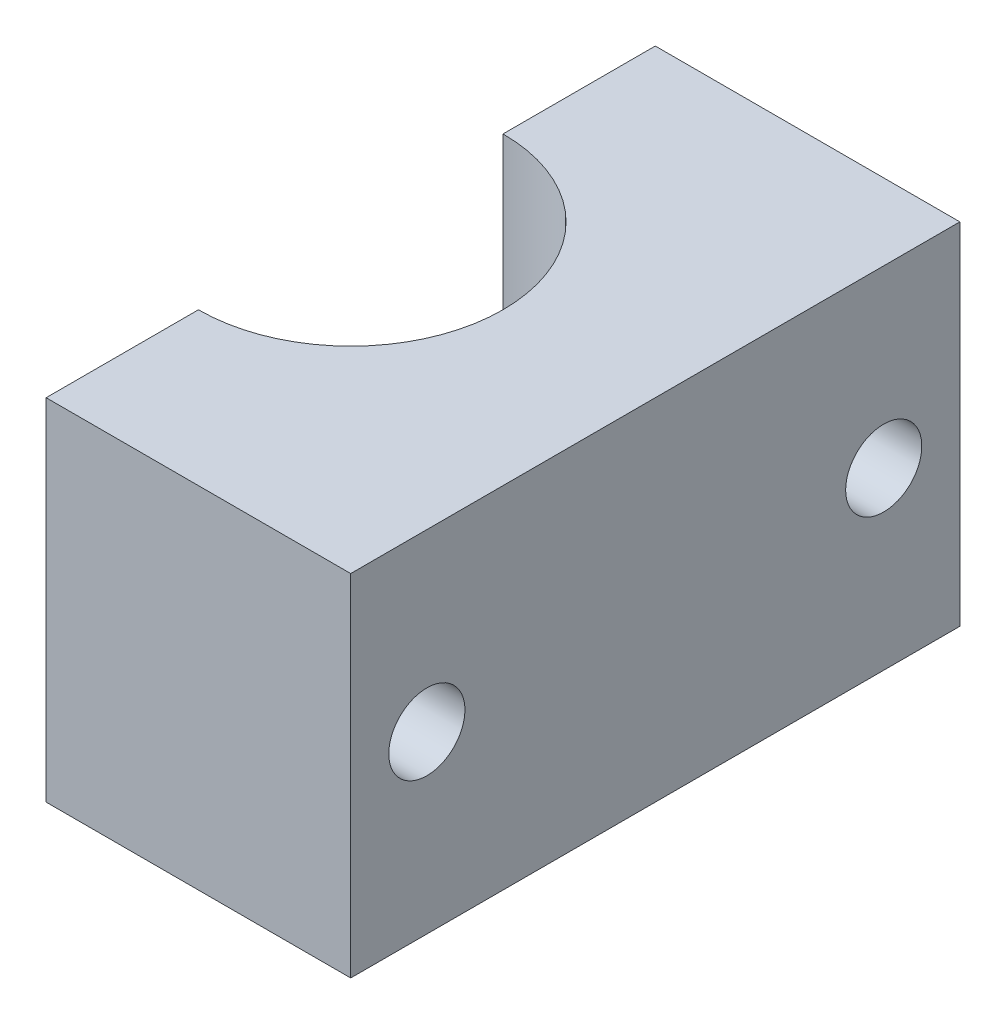
ISO-10303-21;
HEADER;
FILE_DESCRIPTION(('STEP AP214'),'2;1');
FILE_NAME('part.step','',(''),(''),'','','');
FILE_SCHEMA(('AUTOMOTIVE_DESIGN { 1 0 10303 214 1 1 1 1 }'));
ENDSEC;
DATA;
#1=APPLICATION_CONTEXT('core data for automotive mechanical design processes');
#2=APPLICATION_PROTOCOL_DEFINITION('international standard','automotive_design',2000,#1);
#3=PRODUCT_CONTEXT('',#1,'mechanical');
#4=PRODUCT('Part','Part','',(#3));
#5=PRODUCT_RELATED_PRODUCT_CATEGORY('part','',(#4));
#6=PRODUCT_DEFINITION_FORMATION('','',#4);
#7=PRODUCT_DEFINITION_CONTEXT('part definition',#1,'design');
#8=PRODUCT_DEFINITION('design','',#6,#7);
#9=PRODUCT_DEFINITION_SHAPE('','',#8);
#10=(LENGTH_UNIT() NAMED_UNIT(*) SI_UNIT(.MILLI.,.METRE.));
#11=(NAMED_UNIT(*) PLANE_ANGLE_UNIT() SI_UNIT($,.RADIAN.));
#12=(NAMED_UNIT(*) SI_UNIT($,.STERADIAN.) SOLID_ANGLE_UNIT());
#13=UNCERTAINTY_MEASURE_WITH_UNIT(LENGTH_MEASURE(1.E-05),#10,'distance_accuracy_value','');
#14=(GEOMETRIC_REPRESENTATION_CONTEXT(3) GLOBAL_UNCERTAINTY_ASSIGNED_CONTEXT((#13)) GLOBAL_UNIT_ASSIGNED_CONTEXT((#10,
#11,#12)) REPRESENTATION_CONTEXT('',''));
#15=CARTESIAN_POINT('',(0.,0.,0.));
#16=DIRECTION('',(0.,0.,1.));
#17=DIRECTION('',(1.,0.,0.));
#18=AXIS2_PLACEMENT_3D('',#15,#16,#17);
#19=CARTESIAN_POINT('',(0.,29.21,0.));
#20=DIRECTION('',(1.,0.,0.));
#21=DIRECTION('',(0.,0.,-1.));
#22=AXIS2_PLACEMENT_3D('',#19,#20,#21);
#23=PLANE('',#22);
#24=CARTESIAN_POINT('',(0.,14.605,-44.45));
#25=DIRECTION('',(-1.,0.,0.));
#26=DIRECTION('',(0.,0.,1.));
#27=AXIS2_PLACEMENT_3D('',#24,#25,#26);
#28=CIRCLE('',#27,3.175);
#29=CARTESIAN_POINT('',(0.,14.605,-41.275));
#30=VERTEX_POINT('',#29);
#31=EDGE_CURVE('E150',#30,#30,#28,.T.);
#32=ORIENTED_EDGE('',*,*,#31,.F.);
#33=EDGE_LOOP('',(#32));
#34=FACE_BOUND('',#33,.T.);
#35=DIRECTION('',(0.,0.,1.));
#36=VECTOR('',#35,1.);
#37=CARTESIAN_POINT('',(0.,0.,0.));
#38=LINE('',#37,#36);
#39=CARTESIAN_POINT('',(0.,0.,-50.8));
#40=VERTEX_POINT('',#39);
#41=CARTESIAN_POINT('',(0.,0.,-38.1));
#42=VERTEX_POINT('',#41);
#43=EDGE_CURVE('E119',#40,#42,#38,.T.);
#44=ORIENTED_EDGE('',*,*,#43,.T.);
#45=DIRECTION('',(0.,1.,0.));
#46=VECTOR('',#45,1.);
#47=CARTESIAN_POINT('',(0.,0.,-38.1));
#48=LINE('',#47,#46);
#49=CARTESIAN_POINT('',(0.,29.21,-38.1));
#50=VERTEX_POINT('',#49);
#51=EDGE_CURVE('E56',#42,#50,#48,.T.);
#52=ORIENTED_EDGE('',*,*,#51,.T.);
#53=DIRECTION('',(0.,0.,1.));
#54=VECTOR('',#53,1.);
#55=CARTESIAN_POINT('',(0.,29.21,0.));
#56=LINE('',#55,#54);
#57=CARTESIAN_POINT('',(0.,29.21,-50.8));
#58=VERTEX_POINT('',#57);
#59=EDGE_CURVE('E142',#58,#50,#56,.T.);
#60=ORIENTED_EDGE('',*,*,#59,.F.);
#61=DIRECTION('',(0.,-1.,0.));
#62=VECTOR('',#61,1.);
#63=CARTESIAN_POINT('',(0.,29.21,-50.8));
#64=LINE('',#63,#62);
#65=EDGE_CURVE('E129',#58,#40,#64,.T.);
#66=ORIENTED_EDGE('',*,*,#65,.T.);
#67=EDGE_LOOP('',(#44,#52,#60,#66));
#68=FACE_BOUND('',#67,.T.);
#69=ADVANCED_FACE('F41',(#34,#68),#23,.F.);
#70=CARTESIAN_POINT('',(0.,14.605,-6.35));
#71=DIRECTION('',(-1.,0.,0.));
#72=DIRECTION('',(0.,0.,1.));
#73=AXIS2_PLACEMENT_3D('',#70,#71,#72);
#74=CIRCLE('',#73,3.175);
#75=CARTESIAN_POINT('',(0.,14.605,-3.175));
#76=VERTEX_POINT('',#75);
#77=EDGE_CURVE('E156',#76,#76,#74,.T.);
#78=ORIENTED_EDGE('',*,*,#77,.F.);
#79=EDGE_LOOP('',(#78));
#80=FACE_BOUND('',#79,.T.);
#81=CARTESIAN_POINT('',(0.,29.21,-12.7));
#82=VERTEX_POINT('',#81);
#83=CARTESIAN_POINT('',(0.,29.21,0.));
#84=VERTEX_POINT('',#83);
#85=EDGE_CURVE('E93',#82,#84,#56,.T.);
#86=ORIENTED_EDGE('',*,*,#85,.F.);
#87=DIRECTION('',(0.,1.,0.));
#88=VECTOR('',#87,1.);
#89=CARTESIAN_POINT('',(0.,0.,-12.7));
#90=LINE('',#89,#88);
#91=CARTESIAN_POINT('',(0.,0.,-12.7));
#92=VERTEX_POINT('',#91);
#93=EDGE_CURVE('E104',#82,#92,#90,.F.);
#94=ORIENTED_EDGE('',*,*,#93,.T.);
#95=CARTESIAN_POINT('',(0.,0.,0.));
#96=VERTEX_POINT('',#95);
#97=EDGE_CURVE('E113',#92,#96,#38,.T.);
#98=ORIENTED_EDGE('',*,*,#97,.T.);
#99=DIRECTION('',(0.,-1.,0.));
#100=VECTOR('',#99,1.);
#101=CARTESIAN_POINT('',(0.,29.21,0.));
#102=LINE('',#101,#100);
#103=EDGE_CURVE('E11',#84,#96,#102,.T.);
#104=ORIENTED_EDGE('',*,*,#103,.F.);
#105=EDGE_LOOP('',(#86,#94,#98,#104));
#106=FACE_BOUND('',#105,.T.);
#107=ADVANCED_FACE('F43',(#80,#106),#23,.F.);
#108=CARTESIAN_POINT('',(0.,29.21,0.));
#109=DIRECTION('',(0.,0.,-1.));
#110=DIRECTION('',(-1.,0.,0.));
#111=AXIS2_PLACEMENT_3D('',#108,#109,#110);
#112=PLANE('',#111);
#113=DIRECTION('',(1.,0.,0.));
#114=VECTOR('',#113,1.);
#115=CARTESIAN_POINT('',(0.,0.,0.));
#116=LINE('',#115,#114);
#117=CARTESIAN_POINT('',(25.4,0.,0.));
#118=VERTEX_POINT('',#117);
#119=EDGE_CURVE('E118',#96,#118,#116,.T.);
#120=ORIENTED_EDGE('',*,*,#119,.T.);
#121=DIRECTION('',(0.,-1.,0.));
#122=VECTOR('',#121,1.);
#123=CARTESIAN_POINT('',(25.4,29.21,0.));
#124=LINE('',#123,#122);
#125=CARTESIAN_POINT('',(25.4,29.21,0.));
#126=VERTEX_POINT('',#125);
#127=EDGE_CURVE('E49',#126,#118,#124,.T.);
#128=ORIENTED_EDGE('',*,*,#127,.F.);
#129=DIRECTION('',(1.,0.,0.));
#130=VECTOR('',#129,1.);
#131=CARTESIAN_POINT('',(0.,29.21,0.));
#132=LINE('',#131,#130);
#133=EDGE_CURVE('E144',#84,#126,#132,.T.);
#134=ORIENTED_EDGE('',*,*,#133,.F.);
#135=ORIENTED_EDGE('',*,*,#103,.T.);
#136=EDGE_LOOP('',(#120,#128,#134,#135));
#137=FACE_BOUND('',#136,.T.);
#138=ADVANCED_FACE('F172',(#137),#112,.F.);
#139=CARTESIAN_POINT('',(25.4,29.21,0.));
#140=DIRECTION('',(-1.,0.,0.));
#141=DIRECTION('',(0.,0.,1.));
#142=AXIS2_PLACEMENT_3D('',#139,#140,#141);
#143=PLANE('',#142);
#144=CARTESIAN_POINT('',(25.4,14.605,-6.35));
#145=DIRECTION('',(-1.,0.,0.));
#146=DIRECTION('',(0.,0.,1.));
#147=AXIS2_PLACEMENT_3D('',#144,#145,#146);
#148=CIRCLE('',#147,3.175);
#149=CARTESIAN_POINT('',(25.4,14.605,-3.175));
#150=VERTEX_POINT('',#149);
#151=EDGE_CURVE('E153',#150,#150,#148,.T.);
#152=ORIENTED_EDGE('',*,*,#151,.T.);
#153=EDGE_LOOP('',(#152));
#154=FACE_BOUND('',#153,.T.);
#155=CARTESIAN_POINT('',(25.4,14.605,-44.45));
#156=DIRECTION('',(-1.,0.,0.));
#157=DIRECTION('',(0.,0.,1.));
#158=AXIS2_PLACEMENT_3D('',#155,#156,#157);
#159=CIRCLE('',#158,3.175);
#160=CARTESIAN_POINT('',(25.4,14.605,-41.275));
#161=VERTEX_POINT('',#160);
#162=EDGE_CURVE('E148',#161,#161,#159,.T.);
#163=ORIENTED_EDGE('',*,*,#162,.T.);
#164=EDGE_LOOP('',(#163));
#165=FACE_BOUND('',#164,.T.);
#166=DIRECTION('',(0.,0.,-1.));
#167=VECTOR('',#166,1.);
#168=CARTESIAN_POINT('',(25.4,0.,0.));
#169=LINE('',#168,#167);
#170=CARTESIAN_POINT('',(25.4,0.,-50.8));
#171=VERTEX_POINT('',#170);
#172=EDGE_CURVE('E126',#118,#171,#169,.T.);
#173=ORIENTED_EDGE('',*,*,#172,.T.);
#174=DIRECTION('',(0.,-1.,0.));
#175=VECTOR('',#174,1.);
#176=CARTESIAN_POINT('',(25.4,29.21,-50.8));
#177=LINE('',#176,#175);
#178=CARTESIAN_POINT('',(25.4,29.21,-50.8));
#179=VERTEX_POINT('',#178);
#180=EDGE_CURVE('E131',#179,#171,#177,.T.);
#181=ORIENTED_EDGE('',*,*,#180,.F.);
#182=DIRECTION('',(0.,0.,-1.));
#183=VECTOR('',#182,1.);
#184=CARTESIAN_POINT('',(25.4,29.21,0.));
#185=LINE('',#184,#183);
#186=EDGE_CURVE('E138',#126,#179,#185,.T.);
#187=ORIENTED_EDGE('',*,*,#186,.F.);
#188=ORIENTED_EDGE('',*,*,#127,.T.);
#189=EDGE_LOOP('',(#173,#181,#187,#188));
#190=FACE_BOUND('',#189,.T.);
#191=ADVANCED_FACE('F136',(#154,#165,#190),#143,.F.);
#192=CARTESIAN_POINT('',(0.,29.21,-50.8));
#193=DIRECTION('',(0.,0.,1.));
#194=DIRECTION('',(1.,0.,0.));
#195=AXIS2_PLACEMENT_3D('',#192,#193,#194);
#196=PLANE('',#195);
#197=DIRECTION('',(-1.,0.,0.));
#198=VECTOR('',#197,1.);
#199=CARTESIAN_POINT('',(0.,0.,-50.8));
#200=LINE('',#199,#198);
#201=EDGE_CURVE('E86',#171,#40,#200,.T.);
#202=ORIENTED_EDGE('',*,*,#201,.T.);
#203=ORIENTED_EDGE('',*,*,#65,.F.);
#204=DIRECTION('',(-1.,0.,0.));
#205=VECTOR('',#204,1.);
#206=CARTESIAN_POINT('',(0.,29.21,-50.8));
#207=LINE('',#206,#205);
#208=EDGE_CURVE('E65',#179,#58,#207,.T.);
#209=ORIENTED_EDGE('',*,*,#208,.F.);
#210=ORIENTED_EDGE('',*,*,#180,.T.);
#211=EDGE_LOOP('',(#202,#203,#209,#210));
#212=FACE_BOUND('',#211,.T.);
#213=ADVANCED_FACE('F143',(#212),#196,.F.);
#214=CARTESIAN_POINT('',(0.,29.21,0.));
#215=DIRECTION('',(0.,-1.,0.));
#216=DIRECTION('',(0.,0.,-1.));
#217=AXIS2_PLACEMENT_3D('',#214,#215,#216);
#218=PLANE('',#217);
#219=ORIENTED_EDGE('',*,*,#59,.T.);
#220=CARTESIAN_POINT('',(0.,29.21,-25.4));
#221=DIRECTION('',(0.,1.,0.));
#222=DIRECTION('',(0.,0.,1.));
#223=AXIS2_PLACEMENT_3D('',#220,#221,#222);
#224=CIRCLE('',#223,12.7);
#225=EDGE_CURVE('E109',#82,#50,#224,.T.);
#226=ORIENTED_EDGE('',*,*,#225,.F.);
#227=ORIENTED_EDGE('',*,*,#85,.T.);
#228=ORIENTED_EDGE('',*,*,#133,.T.);
#229=ORIENTED_EDGE('',*,*,#186,.T.);
#230=ORIENTED_EDGE('',*,*,#208,.T.);
#231=EDGE_LOOP('',(#219,#226,#227,#228,#229,#230));
#232=FACE_BOUND('',#231,.T.);
#233=ADVANCED_FACE('F191',(#232),#218,.F.);
#234=CARTESIAN_POINT('',(0.,0.,0.));
#235=DIRECTION('',(0.,-1.,0.));
#236=DIRECTION('',(0.,0.,-1.));
#237=AXIS2_PLACEMENT_3D('',#234,#235,#236);
#238=PLANE('',#237);
#239=CARTESIAN_POINT('',(0.,0.,-25.4));
#240=DIRECTION('',(0.,1.,0.));
#241=DIRECTION('',(0.,0.,1.));
#242=AXIS2_PLACEMENT_3D('',#239,#240,#241);
#243=CIRCLE('',#242,12.7);
#244=EDGE_CURVE('E101',#92,#42,#243,.T.);
#245=ORIENTED_EDGE('',*,*,#244,.T.);
#246=ORIENTED_EDGE('',*,*,#43,.F.);
#247=ORIENTED_EDGE('',*,*,#201,.F.);
#248=ORIENTED_EDGE('',*,*,#172,.F.);
#249=ORIENTED_EDGE('',*,*,#119,.F.);
#250=ORIENTED_EDGE('',*,*,#97,.F.);
#251=EDGE_LOOP('',(#245,#246,#247,#248,#249,#250));
#252=FACE_BOUND('',#251,.T.);
#253=ADVANCED_FACE('F116',(#252),#238,.T.);
#254=CARTESIAN_POINT('',(0.,0.,-25.4));
#255=DIRECTION('',(0.,1.,0.));
#256=DIRECTION('',(0.,0.,1.));
#257=AXIS2_PLACEMENT_3D('',#254,#255,#256);
#258=CYLINDRICAL_SURFACE('',#257,12.7);
#259=ORIENTED_EDGE('',*,*,#244,.F.);
#260=ORIENTED_EDGE('',*,*,#93,.F.);
#261=ORIENTED_EDGE('',*,*,#225,.T.);
#262=ORIENTED_EDGE('',*,*,#51,.F.);
#263=EDGE_LOOP('',(#259,#260,#261,#262));
#264=FACE_BOUND('',#263,.T.);
#265=ADVANCED_FACE('F103',(#264),#258,.F.);
#266=CARTESIAN_POINT('',(25.4,14.605,-44.45));
#267=DIRECTION('',(-1.,0.,0.));
#268=DIRECTION('',(0.,0.,1.));
#269=AXIS2_PLACEMENT_3D('',#266,#267,#268);
#270=CYLINDRICAL_SURFACE('',#269,3.175);
#271=ORIENTED_EDGE('',*,*,#162,.F.);
#272=EDGE_LOOP('',(#271));
#273=FACE_BOUND('',#272,.T.);
#274=ORIENTED_EDGE('',*,*,#31,.T.);
#275=EDGE_LOOP('',(#274));
#276=FACE_BOUND('',#275,.T.);
#277=ADVANCED_FACE('F167',(#273,#276),#270,.F.);
#278=CARTESIAN_POINT('',(25.4,14.605,-6.35));
#279=DIRECTION('',(-1.,0.,0.));
#280=DIRECTION('',(0.,0.,1.));
#281=AXIS2_PLACEMENT_3D('',#278,#279,#280);
#282=CYLINDRICAL_SURFACE('',#281,3.175);
#283=ORIENTED_EDGE('',*,*,#151,.F.);
#284=EDGE_LOOP('',(#283));
#285=FACE_BOUND('',#284,.T.);
#286=ORIENTED_EDGE('',*,*,#77,.T.);
#287=EDGE_LOOP('',(#286));
#288=FACE_BOUND('',#287,.T.);
#289=ADVANCED_FACE('F164',(#285,#288),#282,.F.);
#290=CLOSED_SHELL('',(#69,#107,#138,#191,#213,#233,#253,#265,#277,#289));
#291=MANIFOLD_SOLID_BREP('B2',#290);
#292=ADVANCED_BREP_SHAPE_REPRESENTATION('',(#18,#291),#14);
#293=SHAPE_DEFINITION_REPRESENTATION(#9,#292);
ENDSEC;
END-ISO-10303-21;
